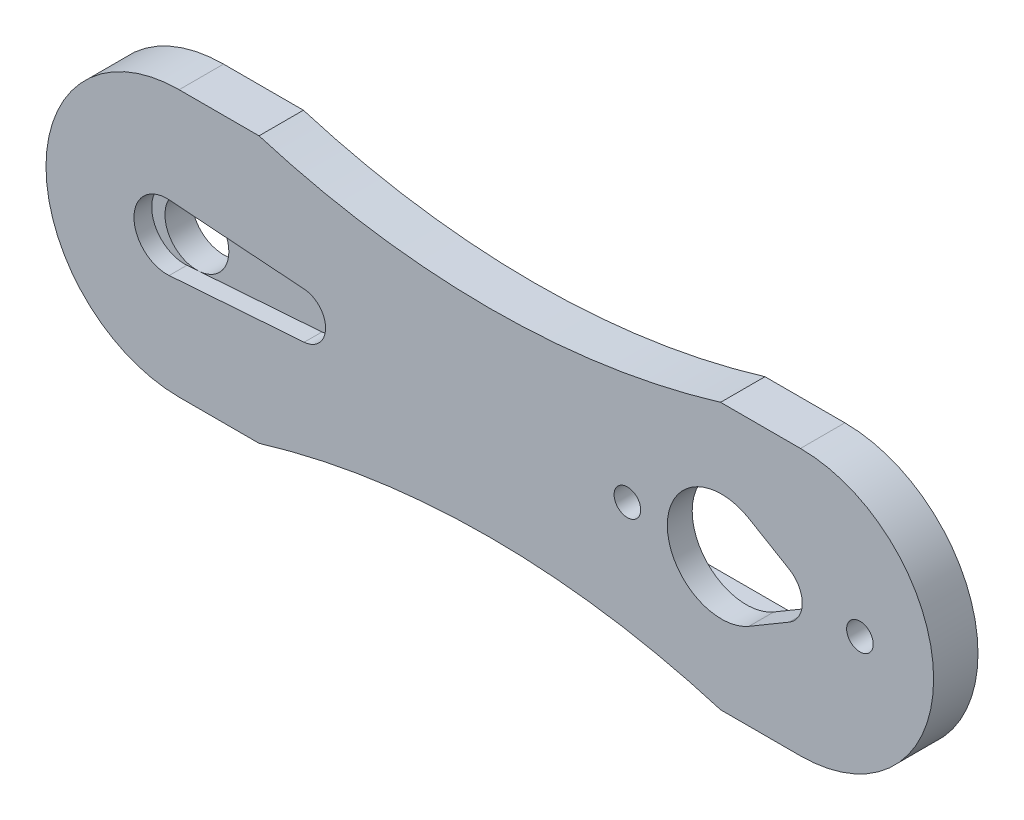
ISO-10303-21;
HEADER;
FILE_DESCRIPTION(('STEP AP214'),'2;1');
FILE_NAME('part.step','',(''),(''),'','','');
FILE_SCHEMA(('AUTOMOTIVE_DESIGN { 1 0 10303 214 1 1 1 1 }'));
ENDSEC;
DATA;
#1=APPLICATION_CONTEXT('core data for automotive mechanical design processes');
#2=APPLICATION_PROTOCOL_DEFINITION('international standard','automotive_design',2000,#1);
#3=PRODUCT_CONTEXT('',#1,'mechanical');
#4=PRODUCT('Part','Part','',(#3));
#5=PRODUCT_RELATED_PRODUCT_CATEGORY('part','',(#4));
#6=PRODUCT_DEFINITION_FORMATION('','',#4);
#7=PRODUCT_DEFINITION_CONTEXT('part definition',#1,'design');
#8=PRODUCT_DEFINITION('design','',#6,#7);
#9=PRODUCT_DEFINITION_SHAPE('','',#8);
#10=(LENGTH_UNIT() NAMED_UNIT(*) SI_UNIT(.MILLI.,.METRE.));
#11=(NAMED_UNIT(*) PLANE_ANGLE_UNIT() SI_UNIT($,.RADIAN.));
#12=(NAMED_UNIT(*) SI_UNIT($,.STERADIAN.) SOLID_ANGLE_UNIT());
#13=UNCERTAINTY_MEASURE_WITH_UNIT(LENGTH_MEASURE(1.E-05),#10,'distance_accuracy_value','');
#14=(GEOMETRIC_REPRESENTATION_CONTEXT(3) GLOBAL_UNCERTAINTY_ASSIGNED_CONTEXT((#13)) GLOBAL_UNIT_ASSIGNED_CONTEXT((#10,
#11,#12)) REPRESENTATION_CONTEXT('',''));
#15=CARTESIAN_POINT('',(0.,0.,0.));
#16=DIRECTION('',(0.,0.,1.));
#17=DIRECTION('',(1.,0.,0.));
#18=AXIS2_PLACEMENT_3D('',#15,#16,#17);
#19=CARTESIAN_POINT('',(35.,86.162636914152,5.));
#20=DIRECTION('',(0.,0.,-1.));
#21=DIRECTION('',(-1.,0.,0.));
#22=AXIS2_PLACEMENT_3D('',#19,#20,#21);
#23=PLANE('',#22);
#24=CARTESIAN_POINT('',(50.5,-15.,5.));
#25=DIRECTION('',(0.,0.,-1.));
#26=DIRECTION('',(-1.,0.,0.));
#27=AXIS2_PLACEMENT_3D('',#24,#25,#26);
#28=CIRCLE('',#27,1.5);
#29=CARTESIAN_POINT('',(49.,-15.,5.));
#30=VERTEX_POINT('',#29);
#31=EDGE_CURVE('E202',#30,#30,#28,.T.);
#32=ORIENTED_EDGE('',*,*,#31,.T.);
#33=EDGE_LOOP('',(#32));
#34=FACE_BOUND('',#33,.T.);
#35=CARTESIAN_POINT('',(76.7,-15.,5.));
#36=DIRECTION('',(0.,0.,-1.));
#37=DIRECTION('',(-1.,0.,0.));
#38=AXIS2_PLACEMENT_3D('',#35,#36,#37);
#39=CIRCLE('',#38,1.5);
#40=CARTESIAN_POINT('',(75.2,-15.,5.));
#41=VERTEX_POINT('',#40);
#42=EDGE_CURVE('E618',#41,#41,#39,.T.);
#43=ORIENTED_EDGE('',*,*,#42,.T.);
#44=EDGE_LOOP('',(#43));
#45=FACE_BOUND('',#44,.T.);
#46=DIRECTION('',(-0.861241018791063,-0.508196721311474,0.));
#47=VECTOR('',#46,1.);
#48=CARTESIAN_POINT('',(89.1175369521095,-5.55035670536318,5.));
#49=LINE('',#48,#47);
#50=CARTESIAN_POINT('',(68.7245901639344,-17.5837230563732,5.));
#51=VERTEX_POINT('',#50);
#52=CARTESIAN_POINT('',(64.2,-20.2535702146255,5.));
#53=VERTEX_POINT('',#52);
#54=EDGE_CURVE('E48',#51,#53,#49,.T.);
#55=ORIENTED_EDGE('',*,*,#54,.T.);
#56=CARTESIAN_POINT('',(61.1,-15.,5.));
#57=DIRECTION('',(0.,0.,-1.));
#58=DIRECTION('',(-1.,0.,0.));
#59=AXIS2_PLACEMENT_3D('',#56,#57,#58);
#60=CIRCLE('',#59,6.1);
#61=CARTESIAN_POINT('',(64.2,-9.74642978537451,5.));
#62=VERTEX_POINT('',#61);
#63=EDGE_CURVE('E11',#53,#62,#60,.T.);
#64=ORIENTED_EDGE('',*,*,#63,.T.);
#65=DIRECTION('',(0.861241018791063,-0.508196721311474,0.));
#66=VECTOR('',#65,1.);
#67=CARTESIAN_POINT('',(0.563839022090895,27.8036725207352,5.));
#68=LINE('',#67,#66);
#69=CARTESIAN_POINT('',(68.7245901639344,-12.4162769436268,5.));
#70=VERTEX_POINT('',#69);
#71=EDGE_CURVE('E188',#62,#70,#68,.T.);
#72=ORIENTED_EDGE('',*,*,#71,.T.);
#73=CARTESIAN_POINT('',(67.2,-15.,5.));
#74=DIRECTION('',(0.,0.,-1.));
#75=DIRECTION('',(-1.,0.,0.));
#76=AXIS2_PLACEMENT_3D('',#73,#74,#75);
#77=CIRCLE('',#76,3.00000000000001);
#78=EDGE_CURVE('E418',#70,#51,#77,.T.);
#79=ORIENTED_EDGE('',*,*,#78,.T.);
#80=EDGE_LOOP('',(#55,#64,#72,#79));
#81=FACE_BOUND('',#80,.T.);
#82=CARTESIAN_POINT('',(35.,86.162636914152,5.));
#83=DIRECTION('',(0.,0.,1.));
#84=DIRECTION('',(-1.,0.,0.));
#85=AXIS2_PLACEMENT_3D('',#82,#83,#84);
#86=CIRCLE('',#85,90.);
#87=CARTESIAN_POINT('',(9.,0.,5.));
#88=VERTEX_POINT('',#87);
#89=CARTESIAN_POINT('',(61.,0.,5.));
#90=VERTEX_POINT('',#89);
#91=EDGE_CURVE('E329',#88,#90,#86,.T.);
#92=ORIENTED_EDGE('',*,*,#91,.F.);
#93=DIRECTION('',(1.,0.,0.));
#94=VECTOR('',#93,1.);
#95=CARTESIAN_POINT('',(0.,0.,5.));
#96=LINE('',#95,#94);
#97=CARTESIAN_POINT('',(0.,0.,5.));
#98=VERTEX_POINT('',#97);
#99=EDGE_CURVE('E358',#98,#88,#96,.T.);
#100=ORIENTED_EDGE('',*,*,#99,.F.);
#101=CARTESIAN_POINT('',(0.,-15.,5.));
#102=DIRECTION('',(0.,0.,-1.));
#103=DIRECTION('',(-1.,0.,0.));
#104=AXIS2_PLACEMENT_3D('',#101,#102,#103);
#105=CIRCLE('',#104,15.);
#106=CARTESIAN_POINT('',(0.,-30.,5.));
#107=VERTEX_POINT('',#106);
#108=EDGE_CURVE('E354',#107,#98,#105,.T.);
#109=ORIENTED_EDGE('',*,*,#108,.F.);
#110=DIRECTION('',(-1.,0.,0.));
#111=VECTOR('',#110,1.);
#112=CARTESIAN_POINT('',(0.,-30.,5.));
#113=LINE('',#112,#111);
#114=CARTESIAN_POINT('',(9.,-30.,5.));
#115=VERTEX_POINT('',#114);
#116=EDGE_CURVE('E350',#115,#107,#113,.T.);
#117=ORIENTED_EDGE('',*,*,#116,.F.);
#118=CARTESIAN_POINT('',(35.,-116.162636914152,5.));
#119=DIRECTION('',(0.,0.,1.));
#120=DIRECTION('',(1.,0.,0.));
#121=AXIS2_PLACEMENT_3D('',#118,#119,#120);
#122=CIRCLE('',#121,90.);
#123=CARTESIAN_POINT('',(61.,-30.,5.));
#124=VERTEX_POINT('',#123);
#125=EDGE_CURVE('E346',#124,#115,#122,.T.);
#126=ORIENTED_EDGE('',*,*,#125,.F.);
#127=DIRECTION('',(-1.,0.,0.));
#128=VECTOR('',#127,1.);
#129=CARTESIAN_POINT('',(70.,-30.,5.));
#130=LINE('',#129,#128);
#131=CARTESIAN_POINT('',(70.,-30.,5.));
#132=VERTEX_POINT('',#131);
#133=EDGE_CURVE('E342',#132,#124,#130,.T.);
#134=ORIENTED_EDGE('',*,*,#133,.F.);
#135=CARTESIAN_POINT('',(70.,-15.,5.));
#136=DIRECTION('',(0.,0.,-1.));
#137=DIRECTION('',(-1.,0.,0.));
#138=AXIS2_PLACEMENT_3D('',#135,#136,#137);
#139=CIRCLE('',#138,15.);
#140=CARTESIAN_POINT('',(70.,0.,5.));
#141=VERTEX_POINT('',#140);
#142=EDGE_CURVE('E338',#141,#132,#139,.T.);
#143=ORIENTED_EDGE('',*,*,#142,.F.);
#144=DIRECTION('',(1.,0.,0.));
#145=VECTOR('',#144,1.);
#146=CARTESIAN_POINT('',(70.,0.,5.));
#147=LINE('',#146,#145);
#148=EDGE_CURVE('E333',#90,#141,#147,.T.);
#149=ORIENTED_EDGE('',*,*,#148,.F.);
#150=EDGE_LOOP('',(#92,#100,#109,#117,#126,#134,#143,#149));
#151=FACE_BOUND('',#150,.T.);
#152=CARTESIAN_POINT('',(-1.39000000000005,-15.,5.));
#153=DIRECTION('',(0.,0.,1.));
#154=DIRECTION('',(1.,0.,0.));
#155=AXIS2_PLACEMENT_3D('',#152,#153,#154);
#156=CIRCLE('',#155,3.7);
#157=CARTESIAN_POINT('',(-1.12381294964034,-11.3095874953847,5.));
#158=VERTEX_POINT('',#157);
#159=CARTESIAN_POINT('',(-1.12381294964034,-18.6904125046153,5.));
#160=VERTEX_POINT('',#159);
#161=EDGE_CURVE('E256',#158,#160,#156,.T.);
#162=ORIENTED_EDGE('',*,*,#161,.F.);
#163=DIRECTION('',(0.997408785031156,-0.0719424460431652,0.));
#164=VECTOR('',#163,1.);
#165=CARTESIAN_POINT('',(-0.817347609745848,-11.3316926407477,5.));
#166=LINE('',#165,#164);
#167=CARTESIAN_POINT('',(14.0870503597122,-12.406737158919,5.));
#168=VERTEX_POINT('',#167);
#169=EDGE_CURVE('E312',#158,#168,#166,.T.);
#170=ORIENTED_EDGE('',*,*,#169,.T.);
#171=CARTESIAN_POINT('',(13.9,-15.,5.));
#172=DIRECTION('',(0.,0.,1.));
#173=DIRECTION('',(1.,0.,0.));
#174=AXIS2_PLACEMENT_3D('',#171,#172,#173);
#175=CIRCLE('',#174,2.6);
#176=CARTESIAN_POINT('',(14.0870503597122,-17.593262841081,5.));
#177=VERTEX_POINT('',#176);
#178=EDGE_CURVE('E288',#168,#177,#175,.F.);
#179=ORIENTED_EDGE('',*,*,#178,.T.);
#180=DIRECTION('',(-0.997408785031156,-0.0719424460431655,0.));
#181=VECTOR('',#180,1.);
#182=CARTESIAN_POINT('',(1.33533322125664,-18.513035892972,5.));
#183=LINE('',#182,#181);
#184=EDGE_CURVE('E297',#177,#160,#183,.T.);
#185=ORIENTED_EDGE('',*,*,#184,.T.);
#186=EDGE_LOOP('',(#162,#170,#179,#185));
#187=FACE_BOUND('',#186,.T.);
#188=ADVANCED_FACE('F39',(#34,#45,#81,#151,#187),#23,.F.);
#189=CARTESIAN_POINT('',(0.,-15.,5.));
#190=DIRECTION('',(0.,0.,-1.));
#191=DIRECTION('',(-1.,0.,0.));
#192=AXIS2_PLACEMENT_3D('',#189,#190,#191);
#193=CYLINDRICAL_SURFACE('',#192,3.6);
#194=CARTESIAN_POINT('',(0.,-15.,0.));
#195=DIRECTION('',(0.,0.,-1.));
#196=DIRECTION('',(1.,0.,0.));
#197=AXIS2_PLACEMENT_3D('',#194,#195,#196);
#198=CIRCLE('',#197,3.6);
#199=CARTESIAN_POINT('',(3.6,-15.,0.));
#200=VERTEX_POINT('',#199);
#201=EDGE_CURVE('E322',#200,#200,#198,.T.);
#202=ORIENTED_EDGE('',*,*,#201,.T.);
#203=EDGE_LOOP('',(#202));
#204=FACE_BOUND('',#203,.T.);
#205=CARTESIAN_POINT('',(0.,-15.,3.));
#206=DIRECTION('',(0.,0.,1.));
#207=DIRECTION('',(1.,0.,0.));
#208=AXIS2_PLACEMENT_3D('',#205,#206,#207);
#209=CIRCLE('',#208,3.6);
#210=CARTESIAN_POINT('',(0.258992805755395,-18.5906716261121,3.));
#211=VERTEX_POINT('',#210);
#212=CARTESIAN_POINT('',(0.258992805755395,-11.4093283738878,3.));
#213=VERTEX_POINT('',#212);
#214=EDGE_CURVE('E277',#211,#213,#209,.F.);
#215=ORIENTED_EDGE('',*,*,#214,.F.);
#216=CARTESIAN_POINT('',(0.,-15.,3.));
#217=DIRECTION('',(0.,0.,1.));
#218=DIRECTION('',(1.,0.,0.));
#219=AXIS2_PLACEMENT_3D('',#216,#217,#218);
#220=CIRCLE('',#219,3.6);
#221=EDGE_CURVE('E300',#213,#211,#220,.F.);
#222=ORIENTED_EDGE('',*,*,#221,.F.);
#223=EDGE_LOOP('',(#215,#222));
#224=FACE_BOUND('',#223,.T.);
#225=ADVANCED_FACE('F438',(#204,#224),#193,.F.);
#226=CARTESIAN_POINT('',(35.,86.162636914152,5.));
#227=DIRECTION('',(0.,0.,-1.));
#228=DIRECTION('',(-1.,0.,0.));
#229=AXIS2_PLACEMENT_3D('',#226,#227,#228);
#230=CYLINDRICAL_SURFACE('',#229,90.);
#231=CARTESIAN_POINT('',(35.,86.162636914152,0.));
#232=DIRECTION('',(0.,0.,1.));
#233=DIRECTION('',(-1.,0.,0.));
#234=AXIS2_PLACEMENT_3D('',#231,#232,#233);
#235=CIRCLE('',#234,90.);
#236=CARTESIAN_POINT('',(9.,0.,0.));
#237=VERTEX_POINT('',#236);
#238=CARTESIAN_POINT('',(61.,0.,0.));
#239=VERTEX_POINT('',#238);
#240=EDGE_CURVE('E328',#237,#239,#235,.T.);
#241=ORIENTED_EDGE('',*,*,#240,.F.);
#242=DIRECTION('',(0.,0.,-1.));
#243=VECTOR('',#242,1.);
#244=CARTESIAN_POINT('',(9.,0.,5.));
#245=LINE('',#244,#243);
#246=EDGE_CURVE('E393',#88,#237,#245,.T.);
#247=ORIENTED_EDGE('',*,*,#246,.F.);
#248=ORIENTED_EDGE('',*,*,#91,.T.);
#249=DIRECTION('',(0.,0.,-1.));
#250=VECTOR('',#249,1.);
#251=CARTESIAN_POINT('',(61.,0.,5.));
#252=LINE('',#251,#250);
#253=EDGE_CURVE('E362',#90,#239,#252,.T.);
#254=ORIENTED_EDGE('',*,*,#253,.T.);
#255=EDGE_LOOP('',(#241,#247,#248,#254));
#256=FACE_BOUND('',#255,.T.);
#257=ADVANCED_FACE('F41',(#256),#230,.F.);
#258=CARTESIAN_POINT('',(0.,0.,5.));
#259=DIRECTION('',(0.,1.,0.));
#260=DIRECTION('',(0.,0.,1.));
#261=AXIS2_PLACEMENT_3D('',#258,#259,#260);
#262=PLANE('',#261);
#263=DIRECTION('',(1.,0.,0.));
#264=VECTOR('',#263,1.);
#265=CARTESIAN_POINT('',(0.,0.,0.));
#266=LINE('',#265,#264);
#267=CARTESIAN_POINT('',(0.,0.,0.));
#268=VERTEX_POINT('',#267);
#269=EDGE_CURVE('E334',#268,#237,#266,.T.);
#270=ORIENTED_EDGE('',*,*,#269,.F.);
#271=DIRECTION('',(0.,0.,-1.));
#272=VECTOR('',#271,1.);
#273=CARTESIAN_POINT('',(0.,0.,5.));
#274=LINE('',#273,#272);
#275=EDGE_CURVE('E396',#98,#268,#274,.T.);
#276=ORIENTED_EDGE('',*,*,#275,.F.);
#277=ORIENTED_EDGE('',*,*,#99,.T.);
#278=ORIENTED_EDGE('',*,*,#246,.T.);
#279=EDGE_LOOP('',(#270,#276,#277,#278));
#280=FACE_BOUND('',#279,.T.);
#281=ADVANCED_FACE('F456',(#280),#262,.T.);
#282=CARTESIAN_POINT('',(0.,-15.,5.));
#283=DIRECTION('',(0.,0.,-1.));
#284=DIRECTION('',(-1.,0.,0.));
#285=AXIS2_PLACEMENT_3D('',#282,#283,#284);
#286=CYLINDRICAL_SURFACE('',#285,15.);
#287=CARTESIAN_POINT('',(0.,-15.,0.));
#288=DIRECTION('',(0.,0.,-1.));
#289=DIRECTION('',(-1.,0.,0.));
#290=AXIS2_PLACEMENT_3D('',#287,#288,#289);
#291=CIRCLE('',#290,15.);
#292=CARTESIAN_POINT('',(0.,-30.,0.));
#293=VERTEX_POINT('',#292);
#294=EDGE_CURVE('E386',#293,#268,#291,.T.);
#295=ORIENTED_EDGE('',*,*,#294,.F.);
#296=DIRECTION('',(0.,0.,-1.));
#297=VECTOR('',#296,1.);
#298=CARTESIAN_POINT('',(0.,-30.,5.));
#299=LINE('',#298,#297);
#300=EDGE_CURVE('E399',#107,#293,#299,.T.);
#301=ORIENTED_EDGE('',*,*,#300,.F.);
#302=ORIENTED_EDGE('',*,*,#108,.T.);
#303=ORIENTED_EDGE('',*,*,#275,.T.);
#304=EDGE_LOOP('',(#295,#301,#302,#303));
#305=FACE_BOUND('',#304,.T.);
#306=ADVANCED_FACE('F459',(#305),#286,.T.);
#307=CARTESIAN_POINT('',(0.,-30.,5.));
#308=DIRECTION('',(0.,-1.,0.));
#309=DIRECTION('',(1.,0.,0.));
#310=AXIS2_PLACEMENT_3D('',#307,#308,#309);
#311=PLANE('',#310);
#312=DIRECTION('',(-1.,0.,0.));
#313=VECTOR('',#312,1.);
#314=CARTESIAN_POINT('',(0.,-30.,0.));
#315=LINE('',#314,#313);
#316=CARTESIAN_POINT('',(9.,-30.,0.));
#317=VERTEX_POINT('',#316);
#318=EDGE_CURVE('E382',#317,#293,#315,.T.);
#319=ORIENTED_EDGE('',*,*,#318,.F.);
#320=DIRECTION('',(0.,0.,-1.));
#321=VECTOR('',#320,1.);
#322=CARTESIAN_POINT('',(9.,-30.,5.));
#323=LINE('',#322,#321);
#324=EDGE_CURVE('E402',#115,#317,#323,.T.);
#325=ORIENTED_EDGE('',*,*,#324,.F.);
#326=ORIENTED_EDGE('',*,*,#116,.T.);
#327=ORIENTED_EDGE('',*,*,#300,.T.);
#328=EDGE_LOOP('',(#319,#325,#326,#327));
#329=FACE_BOUND('',#328,.T.);
#330=ADVANCED_FACE('F463',(#329),#311,.T.);
#331=CARTESIAN_POINT('',(35.,-116.162636914152,5.));
#332=DIRECTION('',(0.,0.,-1.));
#333=DIRECTION('',(-1.,0.,0.));
#334=AXIS2_PLACEMENT_3D('',#331,#332,#333);
#335=CYLINDRICAL_SURFACE('',#334,90.);
#336=CARTESIAN_POINT('',(35.,-116.162636914152,0.));
#337=DIRECTION('',(0.,0.,1.));
#338=DIRECTION('',(1.,0.,0.));
#339=AXIS2_PLACEMENT_3D('',#336,#337,#338);
#340=CIRCLE('',#339,90.);
#341=CARTESIAN_POINT('',(61.,-30.,0.));
#342=VERTEX_POINT('',#341);
#343=EDGE_CURVE('E378',#342,#317,#340,.T.);
#344=ORIENTED_EDGE('',*,*,#343,.F.);
#345=DIRECTION('',(0.,0.,-1.));
#346=VECTOR('',#345,1.);
#347=CARTESIAN_POINT('',(61.,-30.,5.));
#348=LINE('',#347,#346);
#349=EDGE_CURVE('E405',#124,#342,#348,.T.);
#350=ORIENTED_EDGE('',*,*,#349,.F.);
#351=ORIENTED_EDGE('',*,*,#125,.T.);
#352=ORIENTED_EDGE('',*,*,#324,.T.);
#353=EDGE_LOOP('',(#344,#350,#351,#352));
#354=FACE_BOUND('',#353,.T.);
#355=ADVANCED_FACE('F467',(#354),#335,.F.);
#356=CARTESIAN_POINT('',(70.,-30.,5.));
#357=DIRECTION('',(0.,-1.,0.));
#358=DIRECTION('',(1.,0.,0.));
#359=AXIS2_PLACEMENT_3D('',#356,#357,#358);
#360=PLANE('',#359);
#361=DIRECTION('',(-1.,0.,0.));
#362=VECTOR('',#361,1.);
#363=CARTESIAN_POINT('',(70.,-30.,0.));
#364=LINE('',#363,#362);
#365=CARTESIAN_POINT('',(70.,-30.,0.));
#366=VERTEX_POINT('',#365);
#367=EDGE_CURVE('E374',#366,#342,#364,.T.);
#368=ORIENTED_EDGE('',*,*,#367,.F.);
#369=DIRECTION('',(0.,0.,-1.));
#370=VECTOR('',#369,1.);
#371=CARTESIAN_POINT('',(70.,-30.,5.));
#372=LINE('',#371,#370);
#373=EDGE_CURVE('E408',#132,#366,#372,.T.);
#374=ORIENTED_EDGE('',*,*,#373,.F.);
#375=ORIENTED_EDGE('',*,*,#133,.T.);
#376=ORIENTED_EDGE('',*,*,#349,.T.);
#377=EDGE_LOOP('',(#368,#374,#375,#376));
#378=FACE_BOUND('',#377,.T.);
#379=ADVANCED_FACE('F471',(#378),#360,.T.);
#380=CARTESIAN_POINT('',(70.,-15.,5.));
#381=DIRECTION('',(0.,0.,-1.));
#382=DIRECTION('',(-1.,0.,0.));
#383=AXIS2_PLACEMENT_3D('',#380,#381,#382);
#384=CYLINDRICAL_SURFACE('',#383,15.);
#385=CARTESIAN_POINT('',(70.,-15.,0.));
#386=DIRECTION('',(0.,0.,-1.));
#387=DIRECTION('',(-1.,0.,0.));
#388=AXIS2_PLACEMENT_3D('',#385,#386,#387);
#389=CIRCLE('',#388,15.);
#390=CARTESIAN_POINT('',(70.,0.,0.));
#391=VERTEX_POINT('',#390);
#392=EDGE_CURVE('E370',#391,#366,#389,.T.);
#393=ORIENTED_EDGE('',*,*,#392,.F.);
#394=DIRECTION('',(0.,0.,-1.));
#395=VECTOR('',#394,1.);
#396=CARTESIAN_POINT('',(70.,0.,5.));
#397=LINE('',#396,#395);
#398=EDGE_CURVE('E411',#141,#391,#397,.T.);
#399=ORIENTED_EDGE('',*,*,#398,.F.);
#400=ORIENTED_EDGE('',*,*,#142,.T.);
#401=ORIENTED_EDGE('',*,*,#373,.T.);
#402=EDGE_LOOP('',(#393,#399,#400,#401));
#403=FACE_BOUND('',#402,.T.);
#404=ADVANCED_FACE('F475',(#403),#384,.T.);
#405=CARTESIAN_POINT('',(70.,0.,5.));
#406=DIRECTION('',(0.,1.,0.));
#407=DIRECTION('',(-1.,0.,0.));
#408=AXIS2_PLACEMENT_3D('',#405,#406,#407);
#409=PLANE('',#408);
#410=DIRECTION('',(1.,0.,0.));
#411=VECTOR('',#410,1.);
#412=CARTESIAN_POINT('',(70.,0.,0.));
#413=LINE('',#412,#411);
#414=EDGE_CURVE('E366',#239,#391,#413,.T.);
#415=ORIENTED_EDGE('',*,*,#414,.F.);
#416=ORIENTED_EDGE('',*,*,#253,.F.);
#417=ORIENTED_EDGE('',*,*,#148,.T.);
#418=ORIENTED_EDGE('',*,*,#398,.T.);
#419=EDGE_LOOP('',(#415,#416,#417,#418));
#420=FACE_BOUND('',#419,.T.);
#421=ADVANCED_FACE('F454',(#420),#409,.T.);
#422=CARTESIAN_POINT('',(35.,86.162636914152,0.));
#423=DIRECTION('',(0.,0.,-1.));
#424=DIRECTION('',(-1.,0.,0.));
#425=AXIS2_PLACEMENT_3D('',#422,#423,#424);
#426=PLANE('',#425);
#427=DIRECTION('',(0.,-1.,0.));
#428=VECTOR('',#427,1.);
#429=CARTESIAN_POINT('',(80.,-8.49999999999999,0.));
#430=LINE('',#429,#428);
#431=CARTESIAN_POINT('',(80.,-8.49999999999999,0.));
#432=VERTEX_POINT('',#431);
#433=CARTESIAN_POINT('',(80.,-21.5,0.));
#434=VERTEX_POINT('',#433);
#435=EDGE_CURVE('E216',#432,#434,#430,.T.);
#436=ORIENTED_EDGE('',*,*,#435,.F.);
#437=DIRECTION('',(1.,0.,0.));
#438=VECTOR('',#437,1.);
#439=CARTESIAN_POINT('',(80.,-8.49999999999999,0.));
#440=LINE('',#439,#438);
#441=CARTESIAN_POINT('',(47.,-8.49999999999999,0.));
#442=VERTEX_POINT('',#441);
#443=EDGE_CURVE('E227',#442,#432,#440,.T.);
#444=ORIENTED_EDGE('',*,*,#443,.F.);
#445=DIRECTION('',(0.,1.,0.));
#446=VECTOR('',#445,1.);
#447=CARTESIAN_POINT('',(47.,-8.49999999999999,0.));
#448=LINE('',#447,#446);
#449=CARTESIAN_POINT('',(47.,-21.5,0.));
#450=VERTEX_POINT('',#449);
#451=EDGE_CURVE('E246',#450,#442,#448,.T.);
#452=ORIENTED_EDGE('',*,*,#451,.F.);
#453=DIRECTION('',(-1.,0.,0.));
#454=VECTOR('',#453,1.);
#455=CARTESIAN_POINT('',(80.,-21.5,0.));
#456=LINE('',#455,#454);
#457=EDGE_CURVE('E242',#434,#450,#456,.T.);
#458=ORIENTED_EDGE('',*,*,#457,.F.);
#459=EDGE_LOOP('',(#436,#444,#452,#458));
#460=FACE_BOUND('',#459,.T.);
#461=ORIENTED_EDGE('',*,*,#201,.F.);
#462=EDGE_LOOP('',(#461));
#463=FACE_BOUND('',#462,.T.);
#464=ORIENTED_EDGE('',*,*,#240,.T.);
#465=ORIENTED_EDGE('',*,*,#414,.T.);
#466=ORIENTED_EDGE('',*,*,#392,.T.);
#467=ORIENTED_EDGE('',*,*,#367,.T.);
#468=ORIENTED_EDGE('',*,*,#343,.T.);
#469=ORIENTED_EDGE('',*,*,#318,.T.);
#470=ORIENTED_EDGE('',*,*,#294,.T.);
#471=ORIENTED_EDGE('',*,*,#269,.T.);
#472=EDGE_LOOP('',(#464,#465,#466,#467,#468,#469,#470,#471));
#473=FACE_BOUND('',#472,.T.);
#474=ADVANCED_FACE('F450',(#460,#463,#473),#426,.T.);
#475=CARTESIAN_POINT('',(13.9,-15.,3.));
#476=DIRECTION('',(0.,0.,1.));
#477=DIRECTION('',(1.,0.,0.));
#478=AXIS2_PLACEMENT_3D('',#475,#476,#477);
#479=CYLINDRICAL_SURFACE('',#478,2.6);
#480=ORIENTED_EDGE('',*,*,#178,.F.);
#481=DIRECTION('',(0.,0.,1.));
#482=VECTOR('',#481,1.);
#483=CARTESIAN_POINT('',(14.0870503597122,-12.406737158919,3.));
#484=LINE('',#483,#482);
#485=CARTESIAN_POINT('',(14.0870503597122,-12.406737158919,3.));
#486=VERTEX_POINT('',#485);
#487=EDGE_CURVE('E308',#486,#168,#484,.T.);
#488=ORIENTED_EDGE('',*,*,#487,.F.);
#489=CARTESIAN_POINT('',(13.9,-15.,3.));
#490=DIRECTION('',(0.,0.,1.));
#491=DIRECTION('',(1.,0.,0.));
#492=AXIS2_PLACEMENT_3D('',#489,#490,#491);
#493=CIRCLE('',#492,2.6);
#494=CARTESIAN_POINT('',(14.0870503597122,-17.593262841081,3.));
#495=VERTEX_POINT('',#494);
#496=EDGE_CURVE('E292',#486,#495,#493,.F.);
#497=ORIENTED_EDGE('',*,*,#496,.T.);
#498=DIRECTION('',(0.,0.,1.));
#499=VECTOR('',#498,1.);
#500=CARTESIAN_POINT('',(14.0870503597122,-17.593262841081,3.));
#501=LINE('',#500,#499);
#502=EDGE_CURVE('E318',#495,#177,#501,.T.);
#503=ORIENTED_EDGE('',*,*,#502,.T.);
#504=EDGE_LOOP('',(#480,#488,#497,#503));
#505=FACE_BOUND('',#504,.T.);
#506=ADVANCED_FACE('F453',(#505),#479,.F.);
#507=CARTESIAN_POINT('',(1.33533322125664,-18.513035892972,3.));
#508=DIRECTION('',(-0.0719424460431655,0.997408785031156,0.));
#509=DIRECTION('',(-0.997408785031156,-0.0719424460431655,0.));
#510=AXIS2_PLACEMENT_3D('',#507,#508,#509);
#511=PLANE('',#510);
#512=ORIENTED_EDGE('',*,*,#184,.F.);
#513=ORIENTED_EDGE('',*,*,#502,.F.);
#514=DIRECTION('',(-0.997408785031156,-0.0719424460431655,0.));
#515=VECTOR('',#514,1.);
#516=CARTESIAN_POINT('',(1.33533322125664,-18.513035892972,3.));
#517=LINE('',#516,#515);
#518=EDGE_CURVE('E304',#495,#211,#517,.T.);
#519=ORIENTED_EDGE('',*,*,#518,.T.);
#520=DIRECTION('',(-0.997408785031156,-0.0719424460431655,0.));
#521=VECTOR('',#520,1.);
#522=CARTESIAN_POINT('',(1.33533322125664,-18.513035892972,3.));
#523=LINE('',#522,#521);
#524=CARTESIAN_POINT('',(-1.12381294964034,-18.6904125046153,3.));
#525=VERTEX_POINT('',#524);
#526=EDGE_CURVE('E274',#211,#525,#523,.T.);
#527=ORIENTED_EDGE('',*,*,#526,.T.);
#528=DIRECTION('',(0.,0.,1.));
#529=VECTOR('',#528,1.);
#530=CARTESIAN_POINT('',(-1.12381294964034,-18.6904125046153,3.));
#531=LINE('',#530,#529);
#532=EDGE_CURVE('E284',#525,#160,#531,.T.);
#533=ORIENTED_EDGE('',*,*,#532,.T.);
#534=EDGE_LOOP('',(#512,#513,#519,#527,#533));
#535=FACE_BOUND('',#534,.T.);
#536=ADVANCED_FACE('F518',(#535),#511,.T.);
#537=CARTESIAN_POINT('',(-0.817347609745848,-11.3316926407477,3.));
#538=DIRECTION('',(-0.0719424460431652,-0.997408785031156,0.));
#539=DIRECTION('',(0.997408785031156,-0.0719424460431652,0.));
#540=AXIS2_PLACEMENT_3D('',#537,#538,#539);
#541=PLANE('',#540);
#542=ORIENTED_EDGE('',*,*,#169,.F.);
#543=DIRECTION('',(0.,0.,1.));
#544=VECTOR('',#543,1.);
#545=CARTESIAN_POINT('',(-1.12381294964034,-11.3095874953847,3.));
#546=LINE('',#545,#544);
#547=CARTESIAN_POINT('',(-1.12381294964034,-11.3095874953847,3.));
#548=VERTEX_POINT('',#547);
#549=EDGE_CURVE('E280',#548,#158,#546,.T.);
#550=ORIENTED_EDGE('',*,*,#549,.F.);
#551=DIRECTION('',(0.997408785031156,-0.0719424460431652,0.));
#552=VECTOR('',#551,1.);
#553=CARTESIAN_POINT('',(-0.817347609745848,-11.3316926407477,3.));
#554=LINE('',#553,#552);
#555=EDGE_CURVE('E266',#548,#213,#554,.T.);
#556=ORIENTED_EDGE('',*,*,#555,.T.);
#557=DIRECTION('',(0.997408785031156,-0.0719424460431652,0.));
#558=VECTOR('',#557,1.);
#559=CARTESIAN_POINT('',(-0.817347609745848,-11.3316926407477,3.));
#560=LINE('',#559,#558);
#561=EDGE_CURVE('E296',#213,#486,#560,.T.);
#562=ORIENTED_EDGE('',*,*,#561,.T.);
#563=ORIENTED_EDGE('',*,*,#487,.T.);
#564=EDGE_LOOP('',(#542,#550,#556,#562,#563));
#565=FACE_BOUND('',#564,.T.);
#566=ADVANCED_FACE('F509',(#565),#541,.T.);
#567=CARTESIAN_POINT('',(0.,0.,3.));
#568=DIRECTION('',(0.,0.,1.));
#569=DIRECTION('',(1.,0.,0.));
#570=AXIS2_PLACEMENT_3D('',#567,#568,#569);
#571=PLANE('',#570);
#572=ORIENTED_EDGE('',*,*,#496,.F.);
#573=ORIENTED_EDGE('',*,*,#561,.F.);
#574=ORIENTED_EDGE('',*,*,#221,.T.);
#575=ORIENTED_EDGE('',*,*,#518,.F.);
#576=EDGE_LOOP('',(#572,#573,#574,#575));
#577=FACE_BOUND('',#576,.T.);
#578=ADVANCED_FACE('F521',(#577),#571,.T.);
#579=CARTESIAN_POINT('',(-1.39000000000005,-15.,3.));
#580=DIRECTION('',(0.,0.,1.));
#581=DIRECTION('',(1.,0.,0.));
#582=AXIS2_PLACEMENT_3D('',#579,#580,#581);
#583=CYLINDRICAL_SURFACE('',#582,3.7);
#584=ORIENTED_EDGE('',*,*,#161,.T.);
#585=ORIENTED_EDGE('',*,*,#532,.F.);
#586=CARTESIAN_POINT('',(-1.39000000000005,-15.,3.));
#587=DIRECTION('',(0.,0.,1.));
#588=DIRECTION('',(1.,0.,0.));
#589=AXIS2_PLACEMENT_3D('',#586,#587,#588);
#590=CIRCLE('',#589,3.7);
#591=EDGE_CURVE('E270',#548,#525,#590,.T.);
#592=ORIENTED_EDGE('',*,*,#591,.F.);
#593=ORIENTED_EDGE('',*,*,#549,.T.);
#594=EDGE_LOOP('',(#584,#585,#592,#593));
#595=FACE_BOUND('',#594,.T.);
#596=ADVANCED_FACE('F505',(#595),#583,.F.);
#597=CARTESIAN_POINT('',(0.,0.,3.));
#598=DIRECTION('',(0.,0.,1.));
#599=DIRECTION('',(1.,0.,0.));
#600=AXIS2_PLACEMENT_3D('',#597,#598,#599);
#601=PLANE('',#600);
#602=ORIENTED_EDGE('',*,*,#555,.F.);
#603=ORIENTED_EDGE('',*,*,#591,.T.);
#604=ORIENTED_EDGE('',*,*,#526,.F.);
#605=ORIENTED_EDGE('',*,*,#214,.T.);
#606=EDGE_LOOP('',(#602,#603,#604,#605));
#607=FACE_BOUND('',#606,.T.);
#608=ADVANCED_FACE('F512',(#607),#601,.T.);
#609=CARTESIAN_POINT('',(80.,-8.49999999999999,2.2));
#610=DIRECTION('',(1.,0.,0.));
#611=DIRECTION('',(0.,0.,-1.));
#612=AXIS2_PLACEMENT_3D('',#609,#610,#611);
#613=PLANE('',#612);
#614=ORIENTED_EDGE('',*,*,#435,.T.);
#615=DIRECTION('',(0.,0.,-1.));
#616=VECTOR('',#615,1.);
#617=CARTESIAN_POINT('',(80.,-21.5,2.2));
#618=LINE('',#617,#616);
#619=CARTESIAN_POINT('',(80.,-21.5,2.2));
#620=VERTEX_POINT('',#619);
#621=EDGE_CURVE('E239',#620,#434,#618,.T.);
#622=ORIENTED_EDGE('',*,*,#621,.F.);
#623=DIRECTION('',(0.,-1.,0.));
#624=VECTOR('',#623,1.);
#625=CARTESIAN_POINT('',(80.,-8.49999999999999,2.2));
#626=LINE('',#625,#624);
#627=CARTESIAN_POINT('',(80.,-8.49999999999999,2.2));
#628=VERTEX_POINT('',#627);
#629=EDGE_CURVE('E222',#628,#620,#626,.T.);
#630=ORIENTED_EDGE('',*,*,#629,.F.);
#631=DIRECTION('',(0.,0.,-1.));
#632=VECTOR('',#631,1.);
#633=CARTESIAN_POINT('',(80.,-8.49999999999999,2.2));
#634=LINE('',#633,#632);
#635=EDGE_CURVE('E253',#628,#432,#634,.T.);
#636=ORIENTED_EDGE('',*,*,#635,.T.);
#637=EDGE_LOOP('',(#614,#622,#630,#636));
#638=FACE_BOUND('',#637,.T.);
#639=ADVANCED_FACE('F539',(#638),#613,.F.);
#640=CARTESIAN_POINT('',(80.,-8.49999999999999,2.2));
#641=DIRECTION('',(0.,1.,0.));
#642=DIRECTION('',(0.,0.,1.));
#643=AXIS2_PLACEMENT_3D('',#640,#641,#642);
#644=PLANE('',#643);
#645=ORIENTED_EDGE('',*,*,#443,.T.);
#646=ORIENTED_EDGE('',*,*,#635,.F.);
#647=DIRECTION('',(1.,0.,0.));
#648=VECTOR('',#647,1.);
#649=CARTESIAN_POINT('',(80.,-8.49999999999999,2.2));
#650=LINE('',#649,#648);
#651=CARTESIAN_POINT('',(47.,-8.49999999999999,2.2));
#652=VERTEX_POINT('',#651);
#653=EDGE_CURVE('E235',#652,#628,#650,.T.);
#654=ORIENTED_EDGE('',*,*,#653,.F.);
#655=DIRECTION('',(0.,0.,-1.));
#656=VECTOR('',#655,1.);
#657=CARTESIAN_POINT('',(47.,-8.49999999999999,2.2));
#658=LINE('',#657,#656);
#659=EDGE_CURVE('E257',#652,#442,#658,.T.);
#660=ORIENTED_EDGE('',*,*,#659,.T.);
#661=EDGE_LOOP('',(#645,#646,#654,#660));
#662=FACE_BOUND('',#661,.T.);
#663=ADVANCED_FACE('F542',(#662),#644,.F.);
#664=CARTESIAN_POINT('',(47.,-8.49999999999999,2.2));
#665=DIRECTION('',(-1.,0.,0.));
#666=DIRECTION('',(0.,0.,1.));
#667=AXIS2_PLACEMENT_3D('',#664,#665,#666);
#668=PLANE('',#667);
#669=ORIENTED_EDGE('',*,*,#451,.T.);
#670=ORIENTED_EDGE('',*,*,#659,.F.);
#671=DIRECTION('',(0.,1.,0.));
#672=VECTOR('',#671,1.);
#673=CARTESIAN_POINT('',(47.,-8.49999999999999,2.2));
#674=LINE('',#673,#672);
#675=CARTESIAN_POINT('',(47.,-21.5,2.2));
#676=VERTEX_POINT('',#675);
#677=EDGE_CURVE('E231',#676,#652,#674,.T.);
#678=ORIENTED_EDGE('',*,*,#677,.F.);
#679=DIRECTION('',(0.,0.,-1.));
#680=VECTOR('',#679,1.);
#681=CARTESIAN_POINT('',(47.,-21.5,2.2));
#682=LINE('',#681,#680);
#683=EDGE_CURVE('E260',#676,#450,#682,.T.);
#684=ORIENTED_EDGE('',*,*,#683,.T.);
#685=EDGE_LOOP('',(#669,#670,#678,#684));
#686=FACE_BOUND('',#685,.T.);
#687=ADVANCED_FACE('F547',(#686),#668,.F.);
#688=CARTESIAN_POINT('',(80.,-21.5,2.2));
#689=DIRECTION('',(0.,-1.,0.));
#690=DIRECTION('',(0.,0.,-1.));
#691=AXIS2_PLACEMENT_3D('',#688,#689,#690);
#692=PLANE('',#691);
#693=ORIENTED_EDGE('',*,*,#457,.T.);
#694=ORIENTED_EDGE('',*,*,#683,.F.);
#695=DIRECTION('',(-1.,0.,0.));
#696=VECTOR('',#695,1.);
#697=CARTESIAN_POINT('',(80.,-21.5,2.2));
#698=LINE('',#697,#696);
#699=EDGE_CURVE('E226',#620,#676,#698,.T.);
#700=ORIENTED_EDGE('',*,*,#699,.F.);
#701=ORIENTED_EDGE('',*,*,#621,.T.);
#702=EDGE_LOOP('',(#693,#694,#700,#701));
#703=FACE_BOUND('',#702,.T.);
#704=ADVANCED_FACE('F544',(#703),#692,.F.);
#705=CARTESIAN_POINT('',(0.,0.,2.2));
#706=DIRECTION('',(0.,0.,-1.));
#707=DIRECTION('',(-1.,0.,0.));
#708=AXIS2_PLACEMENT_3D('',#705,#706,#707);
#709=PLANE('',#708);
#710=CARTESIAN_POINT('',(50.5,-15.,2.2));
#711=DIRECTION('',(0.,0.,-1.));
#712=DIRECTION('',(-1.,0.,0.));
#713=AXIS2_PLACEMENT_3D('',#710,#711,#712);
#714=CIRCLE('',#713,1.5);
#715=CARTESIAN_POINT('',(49.,-15.,2.2));
#716=VERTEX_POINT('',#715);
#717=EDGE_CURVE('E615',#716,#716,#714,.T.);
#718=ORIENTED_EDGE('',*,*,#717,.F.);
#719=EDGE_LOOP('',(#718));
#720=FACE_BOUND('',#719,.T.);
#721=CARTESIAN_POINT('',(76.7,-15.,2.2));
#722=DIRECTION('',(0.,0.,-1.));
#723=DIRECTION('',(-1.,0.,0.));
#724=AXIS2_PLACEMENT_3D('',#721,#722,#723);
#725=CIRCLE('',#724,1.5);
#726=CARTESIAN_POINT('',(75.2,-15.,2.2));
#727=VERTEX_POINT('',#726);
#728=EDGE_CURVE('E623',#727,#727,#725,.T.);
#729=ORIENTED_EDGE('',*,*,#728,.F.);
#730=EDGE_LOOP('',(#729));
#731=FACE_BOUND('',#730,.T.);
#732=CARTESIAN_POINT('',(61.1,-15.,2.2));
#733=DIRECTION('',(0.,0.,-1.));
#734=DIRECTION('',(-1.,0.,0.));
#735=AXIS2_PLACEMENT_3D('',#732,#733,#734);
#736=CIRCLE('',#735,6.1);
#737=CARTESIAN_POINT('',(64.2,-20.2535702146255,2.2));
#738=VERTEX_POINT('',#737);
#739=CARTESIAN_POINT('',(64.2,-9.74642978537451,2.2));
#740=VERTEX_POINT('',#739);
#741=EDGE_CURVE('E194',#738,#740,#736,.T.);
#742=ORIENTED_EDGE('',*,*,#741,.F.);
#743=DIRECTION('',(-0.861241018791063,-0.508196721311474,0.));
#744=VECTOR('',#743,1.);
#745=CARTESIAN_POINT('',(64.2,-20.2535702146255,2.2));
#746=LINE('',#745,#744);
#747=CARTESIAN_POINT('',(68.7245901639344,-17.5837230563732,2.2));
#748=VERTEX_POINT('',#747);
#749=EDGE_CURVE('E191',#748,#738,#746,.T.);
#750=ORIENTED_EDGE('',*,*,#749,.F.);
#751=CARTESIAN_POINT('',(67.2,-15.,2.2));
#752=DIRECTION('',(0.,0.,-1.));
#753=DIRECTION('',(-1.,0.,0.));
#754=AXIS2_PLACEMENT_3D('',#751,#752,#753);
#755=CIRCLE('',#754,3.00000000000001);
#756=CARTESIAN_POINT('',(68.7245901639344,-12.4162769436268,2.2));
#757=VERTEX_POINT('',#756);
#758=EDGE_CURVE('E55',#757,#748,#755,.T.);
#759=ORIENTED_EDGE('',*,*,#758,.F.);
#760=DIRECTION('',(0.861241018791063,-0.508196721311474,0.));
#761=VECTOR('',#760,1.);
#762=CARTESIAN_POINT('',(64.2,-9.74642978537451,2.2));
#763=LINE('',#762,#761);
#764=EDGE_CURVE('E186',#740,#757,#763,.T.);
#765=ORIENTED_EDGE('',*,*,#764,.F.);
#766=EDGE_LOOP('',(#742,#750,#759,#765));
#767=FACE_BOUND('',#766,.T.);
#768=ORIENTED_EDGE('',*,*,#629,.T.);
#769=ORIENTED_EDGE('',*,*,#699,.T.);
#770=ORIENTED_EDGE('',*,*,#677,.T.);
#771=ORIENTED_EDGE('',*,*,#653,.T.);
#772=EDGE_LOOP('',(#768,#769,#770,#771));
#773=FACE_BOUND('',#772,.T.);
#774=ADVANCED_FACE('F204',(#720,#731,#767,#773),#709,.T.);
#775=CARTESIAN_POINT('',(61.1,-15.,5.2));
#776=DIRECTION('',(0.,0.,-1.));
#777=DIRECTION('',(-1.,0.,0.));
#778=AXIS2_PLACEMENT_3D('',#775,#776,#777);
#779=CYLINDRICAL_SURFACE('',#778,6.1);
#780=DIRECTION('',(0.,0.,-1.));
#781=VECTOR('',#780,1.);
#782=CARTESIAN_POINT('',(64.2,-20.2535702146255,5.2));
#783=LINE('',#782,#781);
#784=EDGE_CURVE('E197',#53,#738,#783,.T.);
#785=ORIENTED_EDGE('',*,*,#784,.T.);
#786=ORIENTED_EDGE('',*,*,#741,.T.);
#787=DIRECTION('',(0.,0.,-1.));
#788=VECTOR('',#787,1.);
#789=CARTESIAN_POINT('',(64.2,-9.74642978537451,5.2));
#790=LINE('',#789,#788);
#791=EDGE_CURVE('E182',#62,#740,#790,.T.);
#792=ORIENTED_EDGE('',*,*,#791,.F.);
#793=ORIENTED_EDGE('',*,*,#63,.F.);
#794=EDGE_LOOP('',(#785,#786,#792,#793));
#795=FACE_BOUND('',#794,.T.);
#796=ADVANCED_FACE('F195',(#795),#779,.F.);
#797=CARTESIAN_POINT('',(64.2,-20.2535702146255,5.2));
#798=DIRECTION('',(0.508196721311474,-0.861241018791063,0.));
#799=DIRECTION('',(0.861241018791063,0.508196721311474,0.));
#800=AXIS2_PLACEMENT_3D('',#797,#798,#799);
#801=PLANE('',#800);
#802=DIRECTION('',(0.,0.,-1.));
#803=VECTOR('',#802,1.);
#804=CARTESIAN_POINT('',(68.7245901639344,-17.5837230563732,5.2));
#805=LINE('',#804,#803);
#806=EDGE_CURVE('E217',#51,#748,#805,.T.);
#807=ORIENTED_EDGE('',*,*,#806,.T.);
#808=ORIENTED_EDGE('',*,*,#749,.T.);
#809=ORIENTED_EDGE('',*,*,#784,.F.);
#810=ORIENTED_EDGE('',*,*,#54,.F.);
#811=EDGE_LOOP('',(#807,#808,#809,#810));
#812=FACE_BOUND('',#811,.T.);
#813=ADVANCED_FACE('F426',(#812),#801,.F.);
#814=CARTESIAN_POINT('',(67.2,-15.,5.2));
#815=DIRECTION('',(0.,0.,-1.));
#816=DIRECTION('',(-1.,0.,0.));
#817=AXIS2_PLACEMENT_3D('',#814,#815,#816);
#818=CYLINDRICAL_SURFACE('',#817,3.00000000000001);
#819=DIRECTION('',(0.,0.,-1.));
#820=VECTOR('',#819,1.);
#821=CARTESIAN_POINT('',(68.7245901639344,-12.4162769436268,5.2));
#822=LINE('',#821,#820);
#823=EDGE_CURVE('E62',#70,#757,#822,.T.);
#824=ORIENTED_EDGE('',*,*,#823,.T.);
#825=ORIENTED_EDGE('',*,*,#758,.T.);
#826=ORIENTED_EDGE('',*,*,#806,.F.);
#827=ORIENTED_EDGE('',*,*,#78,.F.);
#828=EDGE_LOOP('',(#824,#825,#826,#827));
#829=FACE_BOUND('',#828,.T.);
#830=ADVANCED_FACE('F427',(#829),#818,.F.);
#831=CARTESIAN_POINT('',(64.2,-9.74642978537451,5.2));
#832=DIRECTION('',(0.508196721311474,0.861241018791063,0.));
#833=DIRECTION('',(-0.861241018791063,0.508196721311474,0.));
#834=AXIS2_PLACEMENT_3D('',#831,#832,#833);
#835=PLANE('',#834);
#836=ORIENTED_EDGE('',*,*,#791,.T.);
#837=ORIENTED_EDGE('',*,*,#764,.T.);
#838=ORIENTED_EDGE('',*,*,#823,.F.);
#839=ORIENTED_EDGE('',*,*,#71,.F.);
#840=EDGE_LOOP('',(#836,#837,#838,#839));
#841=FACE_BOUND('',#840,.T.);
#842=ADVANCED_FACE('F184',(#841),#835,.F.);
#843=CARTESIAN_POINT('',(76.7,-15.,5.2));
#844=DIRECTION('',(0.,0.,-1.));
#845=DIRECTION('',(-1.,0.,0.));
#846=AXIS2_PLACEMENT_3D('',#843,#844,#845);
#847=CYLINDRICAL_SURFACE('',#846,1.5);
#848=ORIENTED_EDGE('',*,*,#728,.T.);
#849=EDGE_LOOP('',(#848));
#850=FACE_BOUND('',#849,.T.);
#851=ORIENTED_EDGE('',*,*,#42,.F.);
#852=EDGE_LOOP('',(#851));
#853=FACE_BOUND('',#852,.T.);
#854=ADVANCED_FACE('F434',(#850,#853),#847,.F.);
#855=CARTESIAN_POINT('',(50.5,-15.,5.2));
#856=DIRECTION('',(0.,0.,-1.));
#857=DIRECTION('',(-1.,0.,0.));
#858=AXIS2_PLACEMENT_3D('',#855,#856,#857);
#859=CYLINDRICAL_SURFACE('',#858,1.5);
#860=ORIENTED_EDGE('',*,*,#717,.T.);
#861=EDGE_LOOP('',(#860));
#862=FACE_BOUND('',#861,.T.);
#863=ORIENTED_EDGE('',*,*,#31,.F.);
#864=EDGE_LOOP('',(#863));
#865=FACE_BOUND('',#864,.T.);
#866=ADVANCED_FACE('F598',(#862,#865),#859,.F.);
#867=CLOSED_SHELL('',(#188,#225,#257,#281,#306,#330,#355,#379,#404,#421,#474,#506,#536,#566,
#578,#596,#608,#639,#663,#687,#704,#774,#796,#813,#830,#842,#854,#866));
#868=MANIFOLD_SOLID_BREP('B2',#867);
#869=ADVANCED_BREP_SHAPE_REPRESENTATION('',(#18,#868),#14);
#870=SHAPE_DEFINITION_REPRESENTATION(#9,#869);
ENDSEC;
END-ISO-10303-21;
